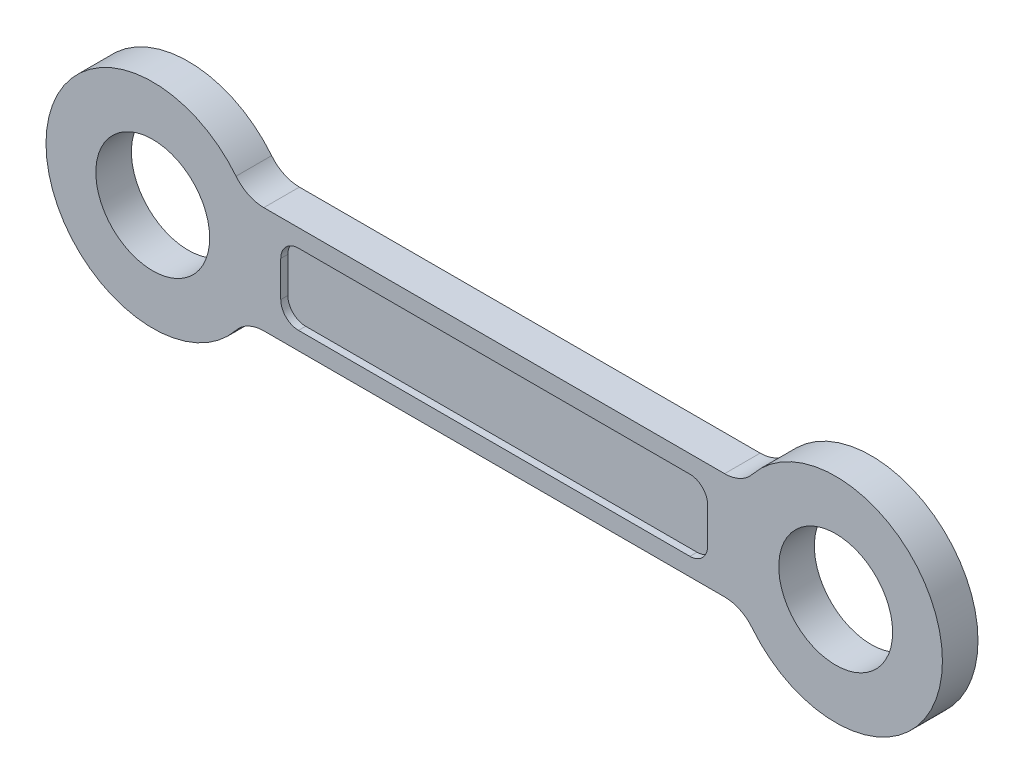
ISO-10303-21;
HEADER;
FILE_DESCRIPTION(('STEP AP214'),'2;1');
FILE_NAME('part.step','',(''),(''),'','','');
FILE_SCHEMA(('AUTOMOTIVE_DESIGN { 1 0 10303 214 1 1 1 1 }'));
ENDSEC;
DATA;
#1=APPLICATION_CONTEXT('core data for automotive mechanical design processes');
#2=APPLICATION_PROTOCOL_DEFINITION('international standard','automotive_design',2000,#1);
#3=PRODUCT_CONTEXT('',#1,'mechanical');
#4=PRODUCT('Part','Part','',(#3));
#5=PRODUCT_RELATED_PRODUCT_CATEGORY('part','',(#4));
#6=PRODUCT_DEFINITION_FORMATION('','',#4);
#7=PRODUCT_DEFINITION_CONTEXT('part definition',#1,'design');
#8=PRODUCT_DEFINITION('design','',#6,#7);
#9=PRODUCT_DEFINITION_SHAPE('','',#8);
#10=(LENGTH_UNIT() NAMED_UNIT(*) SI_UNIT(.MILLI.,.METRE.));
#11=(NAMED_UNIT(*) PLANE_ANGLE_UNIT() SI_UNIT($,.RADIAN.));
#12=(NAMED_UNIT(*) SI_UNIT($,.STERADIAN.) SOLID_ANGLE_UNIT());
#13=UNCERTAINTY_MEASURE_WITH_UNIT(LENGTH_MEASURE(1.E-05),#10,'distance_accuracy_value','');
#14=(GEOMETRIC_REPRESENTATION_CONTEXT(3) GLOBAL_UNCERTAINTY_ASSIGNED_CONTEXT((#13)) GLOBAL_UNIT_ASSIGNED_CONTEXT((#10,
#11,#12)) REPRESENTATION_CONTEXT('',''));
#15=CARTESIAN_POINT('',(0.,0.,0.));
#16=DIRECTION('',(0.,0.,1.));
#17=DIRECTION('',(1.,0.,0.));
#18=AXIS2_PLACEMENT_3D('',#15,#16,#17);
#19=CARTESIAN_POINT('',(95.9807621135332,0.,-5.));
#20=DIRECTION('',(0.,0.,1.));
#21=DIRECTION('',(1.,0.,0.));
#22=AXIS2_PLACEMENT_3D('',#19,#20,#21);
#23=PLANE('',#22);
#24=CARTESIAN_POINT('',(95.9807621135332,0.,-5.));
#25=DIRECTION('',(0.,0.,1.));
#26=DIRECTION('',(1.,0.,0.));
#27=AXIS2_PLACEMENT_3D('',#24,#25,#26);
#28=CIRCLE('',#27,30.);
#29=CARTESIAN_POINT('',(72.5620196195392,-18.75,-5.));
#30=VERTEX_POINT('',#29);
#31=CARTESIAN_POINT('',(72.5620196195392,18.75,-5.));
#32=VERTEX_POINT('',#31);
#33=EDGE_CURVE('E378',#30,#32,#28,.T.);
#34=ORIENTED_EDGE('',*,*,#33,.F.);
#35=CARTESIAN_POINT('',(64.7557721215412,-25.,-5.));
#36=DIRECTION('',(0.,0.,1.));
#37=DIRECTION('',(1.,0.,0.));
#38=AXIS2_PLACEMENT_3D('',#35,#36,#37);
#39=CIRCLE('',#38,10.);
#40=CARTESIAN_POINT('',(64.7557721215412,-15.,-5.));
#41=VERTEX_POINT('',#40);
#42=EDGE_CURVE('E425',#30,#41,#39,.T.);
#43=ORIENTED_EDGE('',*,*,#42,.T.);
#44=DIRECTION('',(1.,0.,0.));
#45=VECTOR('',#44,1.);
#46=CARTESIAN_POINT('',(-70.,-15.,-5.));
#47=LINE('',#46,#45);
#48=CARTESIAN_POINT('',(-64.7557721215412,-15.,-5.));
#49=VERTEX_POINT('',#48);
#50=EDGE_CURVE('E390',#49,#41,#47,.T.);
#51=ORIENTED_EDGE('',*,*,#50,.F.);
#52=CARTESIAN_POINT('',(-64.7557721215412,-25.,-5.));
#53=DIRECTION('',(0.,0.,1.));
#54=DIRECTION('',(1.,0.,0.));
#55=AXIS2_PLACEMENT_3D('',#52,#53,#54);
#56=CIRCLE('',#55,10.);
#57=CARTESIAN_POINT('',(-72.5620196195392,-18.75,-5.));
#58=VERTEX_POINT('',#57);
#59=EDGE_CURVE('E12',#49,#58,#56,.T.);
#60=ORIENTED_EDGE('',*,*,#59,.T.);
#61=CARTESIAN_POINT('',(-95.9807621135331,0.,-5.));
#62=DIRECTION('',(0.,0.,1.));
#63=DIRECTION('',(1.,0.,0.));
#64=AXIS2_PLACEMENT_3D('',#61,#62,#63);
#65=CIRCLE('',#64,30.);
#66=CARTESIAN_POINT('',(-72.5620196195392,18.75,-5.));
#67=VERTEX_POINT('',#66);
#68=EDGE_CURVE('E386',#67,#58,#65,.T.);
#69=ORIENTED_EDGE('',*,*,#68,.F.);
#70=CARTESIAN_POINT('',(-64.7557721215412,25.,-5.));
#71=DIRECTION('',(0.,0.,1.));
#72=DIRECTION('',(1.,0.,0.));
#73=AXIS2_PLACEMENT_3D('',#70,#71,#72);
#74=CIRCLE('',#73,10.);
#75=CARTESIAN_POINT('',(-64.7557721215412,15.,-5.));
#76=VERTEX_POINT('',#75);
#77=EDGE_CURVE('E437',#67,#76,#74,.T.);
#78=ORIENTED_EDGE('',*,*,#77,.T.);
#79=DIRECTION('',(-1.,0.,0.));
#80=VECTOR('',#79,1.);
#81=CARTESIAN_POINT('',(-70.,15.,-5.));
#82=LINE('',#81,#80);
#83=CARTESIAN_POINT('',(64.7557721215412,15.,-5.));
#84=VERTEX_POINT('',#83);
#85=EDGE_CURVE('E382',#84,#76,#82,.T.);
#86=ORIENTED_EDGE('',*,*,#85,.F.);
#87=CARTESIAN_POINT('',(64.7557721215412,25.,-5.));
#88=DIRECTION('',(0.,0.,1.));
#89=DIRECTION('',(1.,0.,0.));
#90=AXIS2_PLACEMENT_3D('',#87,#88,#89);
#91=CIRCLE('',#90,10.);
#92=EDGE_CURVE('E431',#84,#32,#91,.T.);
#93=ORIENTED_EDGE('',*,*,#92,.T.);
#94=EDGE_LOOP('',(#34,#43,#51,#60,#69,#78,#86,#93));
#95=FACE_BOUND('',#94,.T.);
#96=CARTESIAN_POINT('',(-95.9807621135331,0.,-5.));
#97=DIRECTION('',(0.,0.,1.));
#98=DIRECTION('',(1.,0.,0.));
#99=AXIS2_PLACEMENT_3D('',#96,#97,#98);
#100=CIRCLE('',#99,16.);
#101=CARTESIAN_POINT('',(-79.9807621135331,0.,-5.));
#102=VERTEX_POINT('',#101);
#103=EDGE_CURVE('E371',#102,#102,#100,.T.);
#104=ORIENTED_EDGE('',*,*,#103,.T.);
#105=EDGE_LOOP('',(#104));
#106=FACE_BOUND('',#105,.T.);
#107=CARTESIAN_POINT('',(95.9807621135332,0.,-5.));
#108=DIRECTION('',(0.,0.,1.));
#109=DIRECTION('',(1.,0.,0.));
#110=AXIS2_PLACEMENT_3D('',#107,#108,#109);
#111=CIRCLE('',#110,16.);
#112=CARTESIAN_POINT('',(111.980762113533,0.,-5.));
#113=VERTEX_POINT('',#112);
#114=EDGE_CURVE('E366',#113,#113,#111,.T.);
#115=ORIENTED_EDGE('',*,*,#114,.T.);
#116=EDGE_LOOP('',(#115));
#117=FACE_BOUND('',#116,.T.);
#118=CARTESIAN_POINT('',(55.,-4.99999999999999,-5.));
#119=DIRECTION('',(0.,0.,1.));
#120=DIRECTION('',(-1.,0.,0.));
#121=AXIS2_PLACEMENT_3D('',#118,#119,#120);
#122=CIRCLE('',#121,5.);
#123=CARTESIAN_POINT('',(55.,-9.99999999999999,-5.));
#124=VERTEX_POINT('',#123);
#125=CARTESIAN_POINT('',(60.,-4.99999999999996,-5.));
#126=VERTEX_POINT('',#125);
#127=EDGE_CURVE('E64',#124,#126,#122,.T.);
#128=ORIENTED_EDGE('',*,*,#127,.T.);
#129=DIRECTION('',(0.,1.,0.));
#130=VECTOR('',#129,1.);
#131=CARTESIAN_POINT('',(60.,4.99999999999997,-5.));
#132=LINE('',#131,#130);
#133=CARTESIAN_POINT('',(60.,4.99999999999997,-5.));
#134=VERTEX_POINT('',#133);
#135=EDGE_CURVE('E233',#126,#134,#132,.T.);
#136=ORIENTED_EDGE('',*,*,#135,.T.);
#137=CARTESIAN_POINT('',(55.,5.00000000000001,-5.));
#138=DIRECTION('',(0.,0.,1.));
#139=DIRECTION('',(-1.,0.,0.));
#140=AXIS2_PLACEMENT_3D('',#137,#138,#139);
#141=CIRCLE('',#140,5.);
#142=CARTESIAN_POINT('',(55.,10.,-5.));
#143=VERTEX_POINT('',#142);
#144=EDGE_CURVE('E237',#134,#143,#141,.T.);
#145=ORIENTED_EDGE('',*,*,#144,.T.);
#146=DIRECTION('',(-1.,0.,0.));
#147=VECTOR('',#146,1.);
#148=CARTESIAN_POINT('',(55.,10.,-5.));
#149=LINE('',#148,#147);
#150=CARTESIAN_POINT('',(-55.,9.99999999999999,-5.));
#151=VERTEX_POINT('',#150);
#152=EDGE_CURVE('E273',#143,#151,#149,.T.);
#153=ORIENTED_EDGE('',*,*,#152,.T.);
#154=CARTESIAN_POINT('',(-55.,4.99999999999999,-5.));
#155=DIRECTION('',(0.,0.,1.));
#156=DIRECTION('',(1.,0.,0.));
#157=AXIS2_PLACEMENT_3D('',#154,#155,#156);
#158=CIRCLE('',#157,5.);
#159=CARTESIAN_POINT('',(-60.,4.99999999999996,-5.));
#160=VERTEX_POINT('',#159);
#161=EDGE_CURVE('E269',#151,#160,#158,.T.);
#162=ORIENTED_EDGE('',*,*,#161,.T.);
#163=DIRECTION('',(0.,-1.,0.));
#164=VECTOR('',#163,1.);
#165=CARTESIAN_POINT('',(-60.,4.99999999999996,-5.));
#166=LINE('',#165,#164);
#167=CARTESIAN_POINT('',(-60.,-4.99999999999997,-5.));
#168=VERTEX_POINT('',#167);
#169=EDGE_CURVE('E265',#160,#168,#166,.T.);
#170=ORIENTED_EDGE('',*,*,#169,.T.);
#171=CARTESIAN_POINT('',(-55.,-5.00000000000001,-5.));
#172=DIRECTION('',(0.,0.,1.));
#173=DIRECTION('',(-1.,0.,0.));
#174=AXIS2_PLACEMENT_3D('',#171,#172,#173);
#175=CIRCLE('',#174,5.);
#176=CARTESIAN_POINT('',(-55.,-10.,-5.));
#177=VERTEX_POINT('',#176);
#178=EDGE_CURVE('E261',#168,#177,#175,.T.);
#179=ORIENTED_EDGE('',*,*,#178,.T.);
#180=DIRECTION('',(1.,0.,0.));
#181=VECTOR('',#180,1.);
#182=CARTESIAN_POINT('',(55.,-9.99999999999999,-5.));
#183=LINE('',#182,#181);
#184=EDGE_CURVE('E258',#177,#124,#183,.T.);
#185=ORIENTED_EDGE('',*,*,#184,.T.);
#186=EDGE_LOOP('',(#128,#136,#145,#153,#162,#170,#179,#185));
#187=FACE_BOUND('',#186,.T.);
#188=ADVANCED_FACE('F48',(#95,#106,#117,#187),#23,.F.);
#189=CARTESIAN_POINT('',(95.9807621135332,0.,-5.));
#190=DIRECTION('',(0.,0.,1.));
#191=DIRECTION('',(1.,0.,0.));
#192=AXIS2_PLACEMENT_3D('',#189,#190,#191);
#193=CYLINDRICAL_SURFACE('',#192,30.);
#194=CARTESIAN_POINT('',(95.9807621135332,0.,5.));
#195=DIRECTION('',(0.,0.,1.));
#196=DIRECTION('',(1.,0.,0.));
#197=AXIS2_PLACEMENT_3D('',#194,#195,#196);
#198=CIRCLE('',#197,30.);
#199=CARTESIAN_POINT('',(72.5620196195392,-18.75,5.));
#200=VERTEX_POINT('',#199);
#201=CARTESIAN_POINT('',(72.5620196195392,18.75,5.));
#202=VERTEX_POINT('',#201);
#203=EDGE_CURVE('E363',#200,#202,#198,.T.);
#204=ORIENTED_EDGE('',*,*,#203,.F.);
#205=DIRECTION('',(0.,0.,1.));
#206=VECTOR('',#205,1.);
#207=CARTESIAN_POINT('',(72.5620196195392,-18.75,-5.));
#208=LINE('',#207,#206);
#209=EDGE_CURVE('E405',#200,#30,#208,.F.);
#210=ORIENTED_EDGE('',*,*,#209,.T.);
#211=ORIENTED_EDGE('',*,*,#33,.T.);
#212=DIRECTION('',(0.,0.,1.));
#213=VECTOR('',#212,1.);
#214=CARTESIAN_POINT('',(72.5620196195392,18.75,-5.));
#215=LINE('',#214,#213);
#216=EDGE_CURVE('E401',#32,#202,#215,.T.);
#217=ORIENTED_EDGE('',*,*,#216,.T.);
#218=EDGE_LOOP('',(#204,#210,#211,#217));
#219=FACE_BOUND('',#218,.T.);
#220=ADVANCED_FACE('F482',(#219),#193,.T.);
#221=CARTESIAN_POINT('',(-70.,-15.,-5.));
#222=DIRECTION('',(0.,-1.,0.));
#223=DIRECTION('',(0.,0.,-1.));
#224=AXIS2_PLACEMENT_3D('',#221,#222,#223);
#225=PLANE('',#224);
#226=ORIENTED_EDGE('',*,*,#50,.T.);
#227=DIRECTION('',(0.,0.,-1.));
#228=VECTOR('',#227,1.);
#229=CARTESIAN_POINT('',(64.7557721215412,-15.,5.));
#230=LINE('',#229,#228);
#231=CARTESIAN_POINT('',(64.7557721215412,-15.,5.));
#232=VERTEX_POINT('',#231);
#233=EDGE_CURVE('E397',#41,#232,#230,.F.);
#234=ORIENTED_EDGE('',*,*,#233,.T.);
#235=DIRECTION('',(1.,0.,0.));
#236=VECTOR('',#235,1.);
#237=CARTESIAN_POINT('',(-70.,-15.,5.));
#238=LINE('',#237,#236);
#239=CARTESIAN_POINT('',(-64.7557721215412,-15.,5.));
#240=VERTEX_POINT('',#239);
#241=EDGE_CURVE('E372',#240,#232,#238,.T.);
#242=ORIENTED_EDGE('',*,*,#241,.F.);
#243=DIRECTION('',(0.,0.,-1.));
#244=VECTOR('',#243,1.);
#245=CARTESIAN_POINT('',(-64.7557721215412,-15.,-5.));
#246=LINE('',#245,#244);
#247=EDGE_CURVE('E394',#240,#49,#246,.T.);
#248=ORIENTED_EDGE('',*,*,#247,.T.);
#249=EDGE_LOOP('',(#226,#234,#242,#248));
#250=FACE_BOUND('',#249,.T.);
#251=ADVANCED_FACE('F452',(#250),#225,.T.);
#252=CARTESIAN_POINT('',(-95.9807621135331,0.,-5.));
#253=DIRECTION('',(0.,0.,1.));
#254=DIRECTION('',(1.,0.,0.));
#255=AXIS2_PLACEMENT_3D('',#252,#253,#254);
#256=CYLINDRICAL_SURFACE('',#255,30.);
#257=CARTESIAN_POINT('',(-95.9807621135331,0.,5.));
#258=DIRECTION('',(0.,0.,1.));
#259=DIRECTION('',(1.,0.,0.));
#260=AXIS2_PLACEMENT_3D('',#257,#258,#259);
#261=CIRCLE('',#260,30.);
#262=CARTESIAN_POINT('',(-72.5620196195392,18.75,5.));
#263=VERTEX_POINT('',#262);
#264=CARTESIAN_POINT('',(-72.5620196195392,-18.75,5.));
#265=VERTEX_POINT('',#264);
#266=EDGE_CURVE('E447',#263,#265,#261,.T.);
#267=ORIENTED_EDGE('',*,*,#266,.F.);
#268=DIRECTION('',(0.,0.,1.));
#269=VECTOR('',#268,1.);
#270=CARTESIAN_POINT('',(-72.5620196195391,18.75,-5.));
#271=LINE('',#270,#269);
#272=EDGE_CURVE('E419',#263,#67,#271,.F.);
#273=ORIENTED_EDGE('',*,*,#272,.T.);
#274=ORIENTED_EDGE('',*,*,#68,.T.);
#275=DIRECTION('',(0.,0.,1.));
#276=VECTOR('',#275,1.);
#277=CARTESIAN_POINT('',(-72.5620196195391,-18.75,-5.));
#278=LINE('',#277,#276);
#279=EDGE_CURVE('E415',#58,#265,#278,.T.);
#280=ORIENTED_EDGE('',*,*,#279,.T.);
#281=EDGE_LOOP('',(#267,#273,#274,#280));
#282=FACE_BOUND('',#281,.T.);
#283=ADVANCED_FACE('F463',(#282),#256,.T.);
#284=CARTESIAN_POINT('',(-70.,15.,-5.));
#285=DIRECTION('',(0.,1.,0.));
#286=DIRECTION('',(0.,0.,1.));
#287=AXIS2_PLACEMENT_3D('',#284,#285,#286);
#288=PLANE('',#287);
#289=DIRECTION('',(-1.,0.,0.));
#290=VECTOR('',#289,1.);
#291=CARTESIAN_POINT('',(-70.,15.,5.));
#292=LINE('',#291,#290);
#293=CARTESIAN_POINT('',(64.7557721215412,15.,5.));
#294=VERTEX_POINT('',#293);
#295=CARTESIAN_POINT('',(-64.7557721215412,15.,5.));
#296=VERTEX_POINT('',#295);
#297=EDGE_CURVE('E475',#294,#296,#292,.T.);
#298=ORIENTED_EDGE('',*,*,#297,.F.);
#299=DIRECTION('',(0.,0.,-1.));
#300=VECTOR('',#299,1.);
#301=CARTESIAN_POINT('',(64.7557721215412,15.,-5.));
#302=LINE('',#301,#300);
#303=EDGE_CURVE('E412',#294,#84,#302,.T.);
#304=ORIENTED_EDGE('',*,*,#303,.T.);
#305=ORIENTED_EDGE('',*,*,#85,.T.);
#306=DIRECTION('',(0.,0.,-1.));
#307=VECTOR('',#306,1.);
#308=CARTESIAN_POINT('',(-64.7557721215412,15.,5.));
#309=LINE('',#308,#307);
#310=EDGE_CURVE('E408',#76,#296,#309,.F.);
#311=ORIENTED_EDGE('',*,*,#310,.T.);
#312=EDGE_LOOP('',(#298,#304,#305,#311));
#313=FACE_BOUND('',#312,.T.);
#314=ADVANCED_FACE('F472',(#313),#288,.T.);
#315=CARTESIAN_POINT('',(-95.9807621135331,0.,-5.));
#316=DIRECTION('',(0.,0.,1.));
#317=DIRECTION('',(1.,0.,0.));
#318=AXIS2_PLACEMENT_3D('',#315,#316,#317);
#319=CYLINDRICAL_SURFACE('',#318,16.);
#320=ORIENTED_EDGE('',*,*,#103,.F.);
#321=EDGE_LOOP('',(#320));
#322=FACE_BOUND('',#321,.T.);
#323=CARTESIAN_POINT('',(-95.9807621135331,0.,5.));
#324=DIRECTION('',(0.,0.,1.));
#325=DIRECTION('',(1.,0.,0.));
#326=AXIS2_PLACEMENT_3D('',#323,#324,#325);
#327=CIRCLE('',#326,16.);
#328=CARTESIAN_POINT('',(-79.9807621135331,0.,5.));
#329=VERTEX_POINT('',#328);
#330=EDGE_CURVE('E357',#329,#329,#327,.T.);
#331=ORIENTED_EDGE('',*,*,#330,.T.);
#332=EDGE_LOOP('',(#331));
#333=FACE_BOUND('',#332,.T.);
#334=ADVANCED_FACE('F580',(#322,#333),#319,.F.);
#335=CARTESIAN_POINT('',(95.9807621135332,0.,-5.));
#336=DIRECTION('',(0.,0.,1.));
#337=DIRECTION('',(1.,0.,0.));
#338=AXIS2_PLACEMENT_3D('',#335,#336,#337);
#339=CYLINDRICAL_SURFACE('',#338,16.);
#340=ORIENTED_EDGE('',*,*,#114,.F.);
#341=EDGE_LOOP('',(#340));
#342=FACE_BOUND('',#341,.T.);
#343=CARTESIAN_POINT('',(95.9807621135332,0.,5.));
#344=DIRECTION('',(0.,0.,1.));
#345=DIRECTION('',(1.,0.,0.));
#346=AXIS2_PLACEMENT_3D('',#343,#344,#345);
#347=CIRCLE('',#346,16.);
#348=CARTESIAN_POINT('',(111.980762113533,0.,5.));
#349=VERTEX_POINT('',#348);
#350=EDGE_CURVE('E351',#349,#349,#347,.T.);
#351=ORIENTED_EDGE('',*,*,#350,.T.);
#352=EDGE_LOOP('',(#351));
#353=FACE_BOUND('',#352,.T.);
#354=ADVANCED_FACE('F608',(#342,#353),#339,.F.);
#355=CARTESIAN_POINT('',(95.9807621135332,0.,5.));
#356=DIRECTION('',(0.,0.,1.));
#357=DIRECTION('',(1.,0.,0.));
#358=AXIS2_PLACEMENT_3D('',#355,#356,#357);
#359=PLANE('',#358);
#360=CARTESIAN_POINT('',(55.,-4.99999999999999,5.));
#361=DIRECTION('',(0.,0.,1.));
#362=DIRECTION('',(-1.,0.,0.));
#363=AXIS2_PLACEMENT_3D('',#360,#361,#362);
#364=CIRCLE('',#363,5.);
#365=CARTESIAN_POINT('',(55.,-9.99999999999999,5.));
#366=VERTEX_POINT('',#365);
#367=CARTESIAN_POINT('',(60.,-4.99999999999996,5.));
#368=VERTEX_POINT('',#367);
#369=EDGE_CURVE('E72',#366,#368,#364,.T.);
#370=ORIENTED_EDGE('',*,*,#369,.F.);
#371=DIRECTION('',(1.,0.,0.));
#372=VECTOR('',#371,1.);
#373=CARTESIAN_POINT('',(55.,-9.99999999999999,5.));
#374=LINE('',#373,#372);
#375=CARTESIAN_POINT('',(-55.,-10.,5.));
#376=VERTEX_POINT('',#375);
#377=EDGE_CURVE('E305',#376,#366,#374,.T.);
#378=ORIENTED_EDGE('',*,*,#377,.F.);
#379=CARTESIAN_POINT('',(-55.,-5.00000000000001,5.));
#380=DIRECTION('',(0.,0.,1.));
#381=DIRECTION('',(-1.,0.,0.));
#382=AXIS2_PLACEMENT_3D('',#379,#380,#381);
#383=CIRCLE('',#382,5.);
#384=CARTESIAN_POINT('',(-60.,-4.99999999999997,5.));
#385=VERTEX_POINT('',#384);
#386=EDGE_CURVE('E514',#385,#376,#383,.T.);
#387=ORIENTED_EDGE('',*,*,#386,.F.);
#388=DIRECTION('',(0.,-1.,0.));
#389=VECTOR('',#388,1.);
#390=CARTESIAN_POINT('',(-60.,4.99999999999996,5.));
#391=LINE('',#390,#389);
#392=CARTESIAN_POINT('',(-60.,4.99999999999996,5.));
#393=VERTEX_POINT('',#392);
#394=EDGE_CURVE('E518',#393,#385,#391,.T.);
#395=ORIENTED_EDGE('',*,*,#394,.F.);
#396=CARTESIAN_POINT('',(-55.,4.99999999999999,5.));
#397=DIRECTION('',(0.,0.,1.));
#398=DIRECTION('',(1.,0.,0.));
#399=AXIS2_PLACEMENT_3D('',#396,#397,#398);
#400=CIRCLE('',#399,5.);
#401=CARTESIAN_POINT('',(-55.,9.99999999999999,5.));
#402=VERTEX_POINT('',#401);
#403=EDGE_CURVE('E522',#402,#393,#400,.T.);
#404=ORIENTED_EDGE('',*,*,#403,.F.);
#405=DIRECTION('',(-1.,0.,0.));
#406=VECTOR('',#405,1.);
#407=CARTESIAN_POINT('',(55.,10.,5.));
#408=LINE('',#407,#406);
#409=CARTESIAN_POINT('',(55.,10.,5.));
#410=VERTEX_POINT('',#409);
#411=EDGE_CURVE('E526',#410,#402,#408,.T.);
#412=ORIENTED_EDGE('',*,*,#411,.F.);
#413=CARTESIAN_POINT('',(55.,5.00000000000001,5.));
#414=DIRECTION('',(0.,0.,1.));
#415=DIRECTION('',(-1.,0.,0.));
#416=AXIS2_PLACEMENT_3D('',#413,#414,#415);
#417=CIRCLE('',#416,5.);
#418=CARTESIAN_POINT('',(60.,4.99999999999997,5.));
#419=VERTEX_POINT('',#418);
#420=EDGE_CURVE('E341',#419,#410,#417,.T.);
#421=ORIENTED_EDGE('',*,*,#420,.F.);
#422=DIRECTION('',(0.,1.,0.));
#423=VECTOR('',#422,1.);
#424=CARTESIAN_POINT('',(60.,4.99999999999997,5.));
#425=LINE('',#424,#423);
#426=EDGE_CURVE('E336',#368,#419,#425,.T.);
#427=ORIENTED_EDGE('',*,*,#426,.F.);
#428=EDGE_LOOP('',(#370,#378,#387,#395,#404,#412,#421,#427));
#429=FACE_BOUND('',#428,.T.);
#430=ORIENTED_EDGE('',*,*,#330,.F.);
#431=EDGE_LOOP('',(#430));
#432=FACE_BOUND('',#431,.T.);
#433=ORIENTED_EDGE('',*,*,#241,.T.);
#434=CARTESIAN_POINT('',(64.7557721215412,-25.,5.));
#435=DIRECTION('',(0.,0.,1.));
#436=DIRECTION('',(1.,0.,0.));
#437=AXIS2_PLACEMENT_3D('',#434,#435,#436);
#438=CIRCLE('',#437,10.);
#439=EDGE_CURVE('E422',#232,#200,#438,.F.);
#440=ORIENTED_EDGE('',*,*,#439,.T.);
#441=ORIENTED_EDGE('',*,*,#203,.T.);
#442=CARTESIAN_POINT('',(64.7557721215412,25.,5.));
#443=DIRECTION('',(0.,0.,1.));
#444=DIRECTION('',(1.,0.,0.));
#445=AXIS2_PLACEMENT_3D('',#442,#443,#444);
#446=CIRCLE('',#445,10.);
#447=EDGE_CURVE('E428',#202,#294,#446,.F.);
#448=ORIENTED_EDGE('',*,*,#447,.T.);
#449=ORIENTED_EDGE('',*,*,#297,.T.);
#450=CARTESIAN_POINT('',(-64.7557721215412,25.,5.));
#451=DIRECTION('',(0.,0.,1.));
#452=DIRECTION('',(1.,0.,0.));
#453=AXIS2_PLACEMENT_3D('',#450,#451,#452);
#454=CIRCLE('',#453,10.);
#455=EDGE_CURVE('E434',#296,#263,#454,.F.);
#456=ORIENTED_EDGE('',*,*,#455,.T.);
#457=ORIENTED_EDGE('',*,*,#266,.T.);
#458=CARTESIAN_POINT('',(-64.7557721215412,-25.,5.));
#459=DIRECTION('',(0.,0.,1.));
#460=DIRECTION('',(1.,0.,0.));
#461=AXIS2_PLACEMENT_3D('',#458,#459,#460);
#462=CIRCLE('',#461,10.);
#463=EDGE_CURVE('E57',#265,#240,#462,.F.);
#464=ORIENTED_EDGE('',*,*,#463,.T.);
#465=EDGE_LOOP('',(#433,#440,#441,#448,#449,#456,#457,#464));
#466=FACE_BOUND('',#465,.T.);
#467=ORIENTED_EDGE('',*,*,#350,.F.);
#468=EDGE_LOOP('',(#467));
#469=FACE_BOUND('',#468,.T.);
#470=ADVANCED_FACE('F444',(#429,#432,#466,#469),#359,.T.);
#471=CARTESIAN_POINT('',(64.7557721215412,-25.,-5.));
#472=DIRECTION('',(0.,0.,1.));
#473=DIRECTION('',(1.,0.,0.));
#474=AXIS2_PLACEMENT_3D('',#471,#472,#473);
#475=CYLINDRICAL_SURFACE('',#474,10.);
#476=ORIENTED_EDGE('',*,*,#42,.F.);
#477=ORIENTED_EDGE('',*,*,#209,.F.);
#478=ORIENTED_EDGE('',*,*,#439,.F.);
#479=ORIENTED_EDGE('',*,*,#233,.F.);
#480=EDGE_LOOP('',(#476,#477,#478,#479));
#481=FACE_BOUND('',#480,.T.);
#482=ADVANCED_FACE('F486',(#481),#475,.F.);
#483=CARTESIAN_POINT('',(64.7557721215412,25.,-5.));
#484=DIRECTION('',(0.,0.,1.));
#485=DIRECTION('',(1.,0.,0.));
#486=AXIS2_PLACEMENT_3D('',#483,#484,#485);
#487=CYLINDRICAL_SURFACE('',#486,10.);
#488=ORIENTED_EDGE('',*,*,#92,.F.);
#489=ORIENTED_EDGE('',*,*,#303,.F.);
#490=ORIENTED_EDGE('',*,*,#447,.F.);
#491=ORIENTED_EDGE('',*,*,#216,.F.);
#492=EDGE_LOOP('',(#488,#489,#490,#491));
#493=FACE_BOUND('',#492,.T.);
#494=ADVANCED_FACE('F477',(#493),#487,.F.);
#495=CARTESIAN_POINT('',(-64.7557721215412,25.,-5.));
#496=DIRECTION('',(0.,0.,1.));
#497=DIRECTION('',(1.,0.,0.));
#498=AXIS2_PLACEMENT_3D('',#495,#496,#497);
#499=CYLINDRICAL_SURFACE('',#498,10.);
#500=ORIENTED_EDGE('',*,*,#77,.F.);
#501=ORIENTED_EDGE('',*,*,#272,.F.);
#502=ORIENTED_EDGE('',*,*,#455,.F.);
#503=ORIENTED_EDGE('',*,*,#310,.F.);
#504=EDGE_LOOP('',(#500,#501,#502,#503));
#505=FACE_BOUND('',#504,.T.);
#506=ADVANCED_FACE('F466',(#505),#499,.F.);
#507=CARTESIAN_POINT('',(-64.7557721215412,-25.,-5.));
#508=DIRECTION('',(0.,0.,1.));
#509=DIRECTION('',(1.,0.,0.));
#510=AXIS2_PLACEMENT_3D('',#507,#508,#509);
#511=CYLINDRICAL_SURFACE('',#510,10.);
#512=ORIENTED_EDGE('',*,*,#59,.F.);
#513=ORIENTED_EDGE('',*,*,#247,.F.);
#514=ORIENTED_EDGE('',*,*,#463,.F.);
#515=ORIENTED_EDGE('',*,*,#279,.F.);
#516=EDGE_LOOP('',(#512,#513,#514,#515));
#517=FACE_BOUND('',#516,.T.);
#518=ADVANCED_FACE('F50',(#517),#511,.F.);
#519=CARTESIAN_POINT('',(55.,-4.99999999999999,3.));
#520=DIRECTION('',(0.,0.,1.));
#521=DIRECTION('',(1.,0.,0.));
#522=AXIS2_PLACEMENT_3D('',#519,#520,#521);
#523=CYLINDRICAL_SURFACE('',#522,5.);
#524=ORIENTED_EDGE('',*,*,#369,.T.);
#525=DIRECTION('',(0.,0.,1.));
#526=VECTOR('',#525,1.);
#527=CARTESIAN_POINT('',(60.,-4.99999999999996,3.));
#528=LINE('',#527,#526);
#529=CARTESIAN_POINT('',(60.,-4.99999999999996,3.));
#530=VERTEX_POINT('',#529);
#531=EDGE_CURVE('E333',#530,#368,#528,.T.);
#532=ORIENTED_EDGE('',*,*,#531,.F.);
#533=CARTESIAN_POINT('',(55.,-4.99999999999999,3.));
#534=DIRECTION('',(0.,0.,1.));
#535=DIRECTION('',(-1.,0.,0.));
#536=AXIS2_PLACEMENT_3D('',#533,#534,#535);
#537=CIRCLE('',#536,5.);
#538=CARTESIAN_POINT('',(55.,-9.99999999999999,3.));
#539=VERTEX_POINT('',#538);
#540=EDGE_CURVE('E300',#539,#530,#537,.T.);
#541=ORIENTED_EDGE('',*,*,#540,.F.);
#542=DIRECTION('',(0.,0.,1.));
#543=VECTOR('',#542,1.);
#544=CARTESIAN_POINT('',(55.,-9.99999999999999,3.));
#545=LINE('',#544,#543);
#546=EDGE_CURVE('E358',#539,#366,#545,.T.);
#547=ORIENTED_EDGE('',*,*,#546,.T.);
#548=EDGE_LOOP('',(#524,#532,#541,#547));
#549=FACE_BOUND('',#548,.T.);
#550=ADVANCED_FACE('F595',(#549),#523,.F.);
#551=CARTESIAN_POINT('',(55.,-9.99999999999999,3.));
#552=DIRECTION('',(0.,-1.,0.));
#553=DIRECTION('',(1.,0.,0.));
#554=AXIS2_PLACEMENT_3D('',#551,#552,#553);
#555=PLANE('',#554);
#556=ORIENTED_EDGE('',*,*,#377,.T.);
#557=ORIENTED_EDGE('',*,*,#546,.F.);
#558=DIRECTION('',(1.,0.,0.));
#559=VECTOR('',#558,1.);
#560=CARTESIAN_POINT('',(55.,-9.99999999999999,3.));
#561=LINE('',#560,#559);
#562=CARTESIAN_POINT('',(-55.,-10.,3.));
#563=VERTEX_POINT('',#562);
#564=EDGE_CURVE('E329',#563,#539,#561,.T.);
#565=ORIENTED_EDGE('',*,*,#564,.F.);
#566=DIRECTION('',(0.,0.,1.));
#567=VECTOR('',#566,1.);
#568=CARTESIAN_POINT('',(-55.,-10.,3.));
#569=LINE('',#568,#567);
#570=EDGE_CURVE('E493',#563,#376,#569,.T.);
#571=ORIENTED_EDGE('',*,*,#570,.T.);
#572=EDGE_LOOP('',(#556,#557,#565,#571));
#573=FACE_BOUND('',#572,.T.);
#574=ADVANCED_FACE('F554',(#573),#555,.F.);
#575=CARTESIAN_POINT('',(-55.,-5.00000000000001,3.));
#576=DIRECTION('',(0.,0.,1.));
#577=DIRECTION('',(1.,0.,0.));
#578=AXIS2_PLACEMENT_3D('',#575,#576,#577);
#579=CYLINDRICAL_SURFACE('',#578,5.);
#580=ORIENTED_EDGE('',*,*,#386,.T.);
#581=ORIENTED_EDGE('',*,*,#570,.F.);
#582=CARTESIAN_POINT('',(-55.,-5.00000000000001,3.));
#583=DIRECTION('',(0.,0.,1.));
#584=DIRECTION('',(-1.,0.,0.));
#585=AXIS2_PLACEMENT_3D('',#582,#583,#584);
#586=CIRCLE('',#585,5.);
#587=CARTESIAN_POINT('',(-60.,-4.99999999999997,3.));
#588=VERTEX_POINT('',#587);
#589=EDGE_CURVE('E325',#588,#563,#586,.T.);
#590=ORIENTED_EDGE('',*,*,#589,.F.);
#591=DIRECTION('',(0.,0.,1.));
#592=VECTOR('',#591,1.);
#593=CARTESIAN_POINT('',(-60.,-4.99999999999997,3.));
#594=LINE('',#593,#592);
#595=EDGE_CURVE('E496',#588,#385,#594,.T.);
#596=ORIENTED_EDGE('',*,*,#595,.T.);
#597=EDGE_LOOP('',(#580,#581,#590,#596));
#598=FACE_BOUND('',#597,.T.);
#599=ADVANCED_FACE('F558',(#598),#579,.F.);
#600=CARTESIAN_POINT('',(-60.,4.99999999999996,3.));
#601=DIRECTION('',(-1.,0.,0.));
#602=DIRECTION('',(0.,0.,1.));
#603=AXIS2_PLACEMENT_3D('',#600,#601,#602);
#604=PLANE('',#603);
#605=ORIENTED_EDGE('',*,*,#394,.T.);
#606=ORIENTED_EDGE('',*,*,#595,.F.);
#607=DIRECTION('',(0.,-1.,0.));
#608=VECTOR('',#607,1.);
#609=CARTESIAN_POINT('',(-60.,4.99999999999996,3.));
#610=LINE('',#609,#608);
#611=CARTESIAN_POINT('',(-60.,4.99999999999996,3.));
#612=VERTEX_POINT('',#611);
#613=EDGE_CURVE('E321',#612,#588,#610,.T.);
#614=ORIENTED_EDGE('',*,*,#613,.F.);
#615=DIRECTION('',(0.,0.,1.));
#616=VECTOR('',#615,1.);
#617=CARTESIAN_POINT('',(-60.,4.99999999999996,3.));
#618=LINE('',#617,#616);
#619=EDGE_CURVE('E499',#612,#393,#618,.T.);
#620=ORIENTED_EDGE('',*,*,#619,.T.);
#621=EDGE_LOOP('',(#605,#606,#614,#620));
#622=FACE_BOUND('',#621,.T.);
#623=ADVANCED_FACE('F561',(#622),#604,.F.);
#624=CARTESIAN_POINT('',(-55.,4.99999999999999,3.));
#625=DIRECTION('',(0.,0.,1.));
#626=DIRECTION('',(1.,0.,0.));
#627=AXIS2_PLACEMENT_3D('',#624,#625,#626);
#628=CYLINDRICAL_SURFACE('',#627,5.);
#629=ORIENTED_EDGE('',*,*,#403,.T.);
#630=ORIENTED_EDGE('',*,*,#619,.F.);
#631=CARTESIAN_POINT('',(-55.,4.99999999999999,3.));
#632=DIRECTION('',(0.,0.,1.));
#633=DIRECTION('',(1.,0.,0.));
#634=AXIS2_PLACEMENT_3D('',#631,#632,#633);
#635=CIRCLE('',#634,5.);
#636=CARTESIAN_POINT('',(-55.,9.99999999999999,3.));
#637=VERTEX_POINT('',#636);
#638=EDGE_CURVE('E317',#637,#612,#635,.T.);
#639=ORIENTED_EDGE('',*,*,#638,.F.);
#640=DIRECTION('',(0.,0.,1.));
#641=VECTOR('',#640,1.);
#642=CARTESIAN_POINT('',(-55.,9.99999999999999,3.));
#643=LINE('',#642,#641);
#644=EDGE_CURVE('E502',#637,#402,#643,.T.);
#645=ORIENTED_EDGE('',*,*,#644,.T.);
#646=EDGE_LOOP('',(#629,#630,#639,#645));
#647=FACE_BOUND('',#646,.T.);
#648=ADVANCED_FACE('F563',(#647),#628,.F.);
#649=CARTESIAN_POINT('',(55.,10.,3.));
#650=DIRECTION('',(0.,1.,0.));
#651=DIRECTION('',(-1.,0.,0.));
#652=AXIS2_PLACEMENT_3D('',#649,#650,#651);
#653=PLANE('',#652);
#654=ORIENTED_EDGE('',*,*,#411,.T.);
#655=ORIENTED_EDGE('',*,*,#644,.F.);
#656=DIRECTION('',(-1.,0.,0.));
#657=VECTOR('',#656,1.);
#658=CARTESIAN_POINT('',(55.,10.,3.));
#659=LINE('',#658,#657);
#660=CARTESIAN_POINT('',(55.,10.,3.));
#661=VERTEX_POINT('',#660);
#662=EDGE_CURVE('E313',#661,#637,#659,.T.);
#663=ORIENTED_EDGE('',*,*,#662,.F.);
#664=DIRECTION('',(0.,0.,1.));
#665=VECTOR('',#664,1.);
#666=CARTESIAN_POINT('',(55.,10.,3.));
#667=LINE('',#666,#665);
#668=EDGE_CURVE('E505',#661,#410,#667,.T.);
#669=ORIENTED_EDGE('',*,*,#668,.T.);
#670=EDGE_LOOP('',(#654,#655,#663,#669));
#671=FACE_BOUND('',#670,.T.);
#672=ADVANCED_FACE('F543',(#671),#653,.F.);
#673=CARTESIAN_POINT('',(55.,5.00000000000001,3.));
#674=DIRECTION('',(0.,0.,1.));
#675=DIRECTION('',(1.,0.,0.));
#676=AXIS2_PLACEMENT_3D('',#673,#674,#675);
#677=CYLINDRICAL_SURFACE('',#676,5.);
#678=ORIENTED_EDGE('',*,*,#420,.T.);
#679=ORIENTED_EDGE('',*,*,#668,.F.);
#680=CARTESIAN_POINT('',(55.,5.00000000000001,3.));
#681=DIRECTION('',(0.,0.,1.));
#682=DIRECTION('',(-1.,0.,0.));
#683=AXIS2_PLACEMENT_3D('',#680,#681,#682);
#684=CIRCLE('',#683,5.);
#685=CARTESIAN_POINT('',(60.,4.99999999999997,3.));
#686=VERTEX_POINT('',#685);
#687=EDGE_CURVE('E309',#686,#661,#684,.T.);
#688=ORIENTED_EDGE('',*,*,#687,.F.);
#689=DIRECTION('',(0.,0.,1.));
#690=VECTOR('',#689,1.);
#691=CARTESIAN_POINT('',(60.,4.99999999999997,3.));
#692=LINE('',#691,#690);
#693=EDGE_CURVE('E508',#686,#419,#692,.T.);
#694=ORIENTED_EDGE('',*,*,#693,.T.);
#695=EDGE_LOOP('',(#678,#679,#688,#694));
#696=FACE_BOUND('',#695,.T.);
#697=ADVANCED_FACE('F534',(#696),#677,.F.);
#698=CARTESIAN_POINT('',(60.,4.99999999999997,3.));
#699=DIRECTION('',(1.,0.,0.));
#700=DIRECTION('',(0.,0.,-1.));
#701=AXIS2_PLACEMENT_3D('',#698,#699,#700);
#702=PLANE('',#701);
#703=ORIENTED_EDGE('',*,*,#426,.T.);
#704=ORIENTED_EDGE('',*,*,#693,.F.);
#705=DIRECTION('',(0.,1.,0.));
#706=VECTOR('',#705,1.);
#707=CARTESIAN_POINT('',(60.,4.99999999999997,3.));
#708=LINE('',#707,#706);
#709=EDGE_CURVE('E304',#530,#686,#708,.T.);
#710=ORIENTED_EDGE('',*,*,#709,.F.);
#711=ORIENTED_EDGE('',*,*,#531,.T.);
#712=EDGE_LOOP('',(#703,#704,#710,#711));
#713=FACE_BOUND('',#712,.T.);
#714=ADVANCED_FACE('F550',(#713),#702,.F.);
#715=CARTESIAN_POINT('',(55.,-4.99999999999999,3.));
#716=DIRECTION('',(0.,0.,-1.));
#717=DIRECTION('',(-1.,0.,0.));
#718=AXIS2_PLACEMENT_3D('',#715,#716,#717);
#719=PLANE('',#718);
#720=ORIENTED_EDGE('',*,*,#540,.T.);
#721=ORIENTED_EDGE('',*,*,#709,.T.);
#722=ORIENTED_EDGE('',*,*,#687,.T.);
#723=ORIENTED_EDGE('',*,*,#662,.T.);
#724=ORIENTED_EDGE('',*,*,#638,.T.);
#725=ORIENTED_EDGE('',*,*,#613,.T.);
#726=ORIENTED_EDGE('',*,*,#589,.T.);
#727=ORIENTED_EDGE('',*,*,#564,.T.);
#728=EDGE_LOOP('',(#720,#721,#722,#723,#724,#725,#726,#727));
#729=FACE_BOUND('',#728,.T.);
#730=ADVANCED_FACE('F546',(#729),#719,.F.);
#731=CARTESIAN_POINT('',(55.,-4.99999999999999,-3.));
#732=DIRECTION('',(0.,0.,-1.));
#733=DIRECTION('',(-1.,0.,0.));
#734=AXIS2_PLACEMENT_3D('',#731,#732,#733);
#735=CYLINDRICAL_SURFACE('',#734,5.);
#736=ORIENTED_EDGE('',*,*,#127,.F.);
#737=DIRECTION('',(0.,0.,-1.));
#738=VECTOR('',#737,1.);
#739=CARTESIAN_POINT('',(55.,-9.99999999999999,-3.));
#740=LINE('',#739,#738);
#741=CARTESIAN_POINT('',(55.,-9.99999999999999,-3.));
#742=VERTEX_POINT('',#741);
#743=EDGE_CURVE('E214',#742,#124,#740,.T.);
#744=ORIENTED_EDGE('',*,*,#743,.F.);
#745=CARTESIAN_POINT('',(55.,-4.99999999999999,-3.));
#746=DIRECTION('',(0.,0.,1.));
#747=DIRECTION('',(-1.,0.,0.));
#748=AXIS2_PLACEMENT_3D('',#745,#746,#747);
#749=CIRCLE('',#748,5.);
#750=CARTESIAN_POINT('',(60.,-4.99999999999996,-3.));
#751=VERTEX_POINT('',#750);
#752=EDGE_CURVE('E222',#742,#751,#749,.T.);
#753=ORIENTED_EDGE('',*,*,#752,.T.);
#754=DIRECTION('',(0.,0.,-1.));
#755=VECTOR('',#754,1.);
#756=CARTESIAN_POINT('',(60.,-4.99999999999996,-3.));
#757=LINE('',#756,#755);
#758=EDGE_CURVE('E280',#751,#126,#757,.T.);
#759=ORIENTED_EDGE('',*,*,#758,.T.);
#760=EDGE_LOOP('',(#736,#744,#753,#759));
#761=FACE_BOUND('',#760,.T.);
#762=ADVANCED_FACE('F225',(#761),#735,.F.);
#763=CARTESIAN_POINT('',(60.,4.99999999999997,-3.));
#764=DIRECTION('',(-1.,0.,0.));
#765=DIRECTION('',(0.,0.,1.));
#766=AXIS2_PLACEMENT_3D('',#763,#764,#765);
#767=PLANE('',#766);
#768=ORIENTED_EDGE('',*,*,#135,.F.);
#769=ORIENTED_EDGE('',*,*,#758,.F.);
#770=DIRECTION('',(0.,1.,0.));
#771=VECTOR('',#770,1.);
#772=CARTESIAN_POINT('',(60.,4.99999999999997,-3.));
#773=LINE('',#772,#771);
#774=CARTESIAN_POINT('',(60.,4.99999999999997,-3.));
#775=VERTEX_POINT('',#774);
#776=EDGE_CURVE('E228',#751,#775,#773,.T.);
#777=ORIENTED_EDGE('',*,*,#776,.T.);
#778=DIRECTION('',(0.,0.,-1.));
#779=VECTOR('',#778,1.);
#780=CARTESIAN_POINT('',(60.,4.99999999999997,-3.));
#781=LINE('',#780,#779);
#782=EDGE_CURVE('E283',#775,#134,#781,.T.);
#783=ORIENTED_EDGE('',*,*,#782,.T.);
#784=EDGE_LOOP('',(#768,#769,#777,#783));
#785=FACE_BOUND('',#784,.T.);
#786=ADVANCED_FACE('F644',(#785),#767,.T.);
#787=CARTESIAN_POINT('',(55.,5.00000000000001,-3.));
#788=DIRECTION('',(0.,0.,-1.));
#789=DIRECTION('',(-1.,0.,0.));
#790=AXIS2_PLACEMENT_3D('',#787,#788,#789);
#791=CYLINDRICAL_SURFACE('',#790,5.);
#792=ORIENTED_EDGE('',*,*,#144,.F.);
#793=ORIENTED_EDGE('',*,*,#782,.F.);
#794=CARTESIAN_POINT('',(55.,5.00000000000001,-3.));
#795=DIRECTION('',(0.,0.,1.));
#796=DIRECTION('',(-1.,0.,0.));
#797=AXIS2_PLACEMENT_3D('',#794,#795,#796);
#798=CIRCLE('',#797,5.);
#799=CARTESIAN_POINT('',(55.,10.,-3.));
#800=VERTEX_POINT('',#799);
#801=EDGE_CURVE('E251',#775,#800,#798,.T.);
#802=ORIENTED_EDGE('',*,*,#801,.T.);
#803=DIRECTION('',(0.,0.,-1.));
#804=VECTOR('',#803,1.);
#805=CARTESIAN_POINT('',(55.,10.,-3.));
#806=LINE('',#805,#804);
#807=EDGE_CURVE('E286',#800,#143,#806,.T.);
#808=ORIENTED_EDGE('',*,*,#807,.T.);
#809=EDGE_LOOP('',(#792,#793,#802,#808));
#810=FACE_BOUND('',#809,.T.);
#811=ADVANCED_FACE('F642',(#810),#791,.F.);
#812=CARTESIAN_POINT('',(55.,10.,-3.));
#813=DIRECTION('',(0.,-1.,0.));
#814=DIRECTION('',(1.,0.,0.));
#815=AXIS2_PLACEMENT_3D('',#812,#813,#814);
#816=PLANE('',#815);
#817=ORIENTED_EDGE('',*,*,#152,.F.);
#818=ORIENTED_EDGE('',*,*,#807,.F.);
#819=DIRECTION('',(-1.,0.,0.));
#820=VECTOR('',#819,1.);
#821=CARTESIAN_POINT('',(55.,10.,-3.));
#822=LINE('',#821,#820);
#823=CARTESIAN_POINT('',(-55.,9.99999999999999,-3.));
#824=VERTEX_POINT('',#823);
#825=EDGE_CURVE('E248',#800,#824,#822,.T.);
#826=ORIENTED_EDGE('',*,*,#825,.T.);
#827=DIRECTION('',(0.,0.,-1.));
#828=VECTOR('',#827,1.);
#829=CARTESIAN_POINT('',(-55.,9.99999999999999,-3.));
#830=LINE('',#829,#828);
#831=EDGE_CURVE('E289',#824,#151,#830,.T.);
#832=ORIENTED_EDGE('',*,*,#831,.T.);
#833=EDGE_LOOP('',(#817,#818,#826,#832));
#834=FACE_BOUND('',#833,.T.);
#835=ADVANCED_FACE('F637',(#834),#816,.T.);
#836=CARTESIAN_POINT('',(-55.,4.99999999999999,-3.));
#837=DIRECTION('',(0.,0.,-1.));
#838=DIRECTION('',(-1.,0.,0.));
#839=AXIS2_PLACEMENT_3D('',#836,#837,#838);
#840=CYLINDRICAL_SURFACE('',#839,5.);
#841=ORIENTED_EDGE('',*,*,#161,.F.);
#842=ORIENTED_EDGE('',*,*,#831,.F.);
#843=CARTESIAN_POINT('',(-55.,4.99999999999999,-3.));
#844=DIRECTION('',(0.,0.,1.));
#845=DIRECTION('',(1.,0.,0.));
#846=AXIS2_PLACEMENT_3D('',#843,#844,#845);
#847=CIRCLE('',#846,5.);
#848=CARTESIAN_POINT('',(-60.,4.99999999999996,-3.));
#849=VERTEX_POINT('',#848);
#850=EDGE_CURVE('E245',#824,#849,#847,.T.);
#851=ORIENTED_EDGE('',*,*,#850,.T.);
#852=DIRECTION('',(0.,0.,-1.));
#853=VECTOR('',#852,1.);
#854=CARTESIAN_POINT('',(-60.,4.99999999999996,-3.));
#855=LINE('',#854,#853);
#856=EDGE_CURVE('E292',#849,#160,#855,.T.);
#857=ORIENTED_EDGE('',*,*,#856,.T.);
#858=EDGE_LOOP('',(#841,#842,#851,#857));
#859=FACE_BOUND('',#858,.T.);
#860=ADVANCED_FACE('F633',(#859),#840,.F.);
#861=CARTESIAN_POINT('',(-60.,4.99999999999996,-3.));
#862=DIRECTION('',(1.,0.,0.));
#863=DIRECTION('',(0.,0.,-1.));
#864=AXIS2_PLACEMENT_3D('',#861,#862,#863);
#865=PLANE('',#864);
#866=ORIENTED_EDGE('',*,*,#169,.F.);
#867=ORIENTED_EDGE('',*,*,#856,.F.);
#868=DIRECTION('',(0.,-1.,0.));
#869=VECTOR('',#868,1.);
#870=CARTESIAN_POINT('',(-60.,4.99999999999996,-3.));
#871=LINE('',#870,#869);
#872=CARTESIAN_POINT('',(-60.,-4.99999999999997,-3.));
#873=VERTEX_POINT('',#872);
#874=EDGE_CURVE('E242',#849,#873,#871,.T.);
#875=ORIENTED_EDGE('',*,*,#874,.T.);
#876=DIRECTION('',(0.,0.,-1.));
#877=VECTOR('',#876,1.);
#878=CARTESIAN_POINT('',(-60.,-4.99999999999997,-3.));
#879=LINE('',#878,#877);
#880=EDGE_CURVE('E295',#873,#168,#879,.T.);
#881=ORIENTED_EDGE('',*,*,#880,.T.);
#882=EDGE_LOOP('',(#866,#867,#875,#881));
#883=FACE_BOUND('',#882,.T.);
#884=ADVANCED_FACE('F630',(#883),#865,.T.);
#885=CARTESIAN_POINT('',(-55.,-5.00000000000001,-3.));
#886=DIRECTION('',(0.,0.,-1.));
#887=DIRECTION('',(-1.,0.,0.));
#888=AXIS2_PLACEMENT_3D('',#885,#886,#887);
#889=CYLINDRICAL_SURFACE('',#888,5.);
#890=ORIENTED_EDGE('',*,*,#178,.F.);
#891=ORIENTED_EDGE('',*,*,#880,.F.);
#892=CARTESIAN_POINT('',(-55.,-5.00000000000001,-3.));
#893=DIRECTION('',(0.,0.,1.));
#894=DIRECTION('',(-1.,0.,0.));
#895=AXIS2_PLACEMENT_3D('',#892,#893,#894);
#896=CIRCLE('',#895,5.);
#897=CARTESIAN_POINT('',(-55.,-10.,-3.));
#898=VERTEX_POINT('',#897);
#899=EDGE_CURVE('E221',#873,#898,#896,.T.);
#900=ORIENTED_EDGE('',*,*,#899,.T.);
#901=DIRECTION('',(0.,0.,-1.));
#902=VECTOR('',#901,1.);
#903=CARTESIAN_POINT('',(-55.,-10.,-3.));
#904=LINE('',#903,#902);
#905=EDGE_CURVE('E216',#898,#177,#904,.T.);
#906=ORIENTED_EDGE('',*,*,#905,.T.);
#907=EDGE_LOOP('',(#890,#891,#900,#906));
#908=FACE_BOUND('',#907,.T.);
#909=ADVANCED_FACE('F624',(#908),#889,.F.);
#910=CARTESIAN_POINT('',(55.,-9.99999999999999,-3.));
#911=DIRECTION('',(0.,1.,0.));
#912=DIRECTION('',(-1.,0.,0.));
#913=AXIS2_PLACEMENT_3D('',#910,#911,#912);
#914=PLANE('',#913);
#915=ORIENTED_EDGE('',*,*,#184,.F.);
#916=ORIENTED_EDGE('',*,*,#905,.F.);
#917=DIRECTION('',(1.,0.,0.));
#918=VECTOR('',#917,1.);
#919=CARTESIAN_POINT('',(55.,-9.99999999999999,-3.));
#920=LINE('',#919,#918);
#921=EDGE_CURVE('E211',#898,#742,#920,.T.);
#922=ORIENTED_EDGE('',*,*,#921,.T.);
#923=ORIENTED_EDGE('',*,*,#743,.T.);
#924=EDGE_LOOP('',(#915,#916,#922,#923));
#925=FACE_BOUND('',#924,.T.);
#926=ADVANCED_FACE('F213',(#925),#914,.T.);
#927=CARTESIAN_POINT('',(55.,-4.99999999999999,-3.));
#928=DIRECTION('',(0.,0.,1.));
#929=DIRECTION('',(-1.,0.,0.));
#930=AXIS2_PLACEMENT_3D('',#927,#928,#929);
#931=PLANE('',#930);
#932=ORIENTED_EDGE('',*,*,#752,.F.);
#933=ORIENTED_EDGE('',*,*,#921,.F.);
#934=ORIENTED_EDGE('',*,*,#899,.F.);
#935=ORIENTED_EDGE('',*,*,#874,.F.);
#936=ORIENTED_EDGE('',*,*,#850,.F.);
#937=ORIENTED_EDGE('',*,*,#825,.F.);
#938=ORIENTED_EDGE('',*,*,#801,.F.);
#939=ORIENTED_EDGE('',*,*,#776,.F.);
#940=EDGE_LOOP('',(#932,#933,#934,#935,#936,#937,#938,#939));
#941=FACE_BOUND('',#940,.T.);
#942=ADVANCED_FACE('F230',(#941),#931,.F.);
#943=CLOSED_SHELL('',(#188,#220,#251,#283,#314,#334,#354,#470,#482,#494,#506,#518,#550,#574,
#599,#623,#648,#672,#697,#714,#730,#762,#786,#811,#835,#860,#884,#909,#926,#942));
#944=MANIFOLD_SOLID_BREP('B2',#943);
#945=ADVANCED_BREP_SHAPE_REPRESENTATION('',(#18,#944),#14);
#946=SHAPE_DEFINITION_REPRESENTATION(#9,#945);
ENDSEC;
END-ISO-10303-21;
